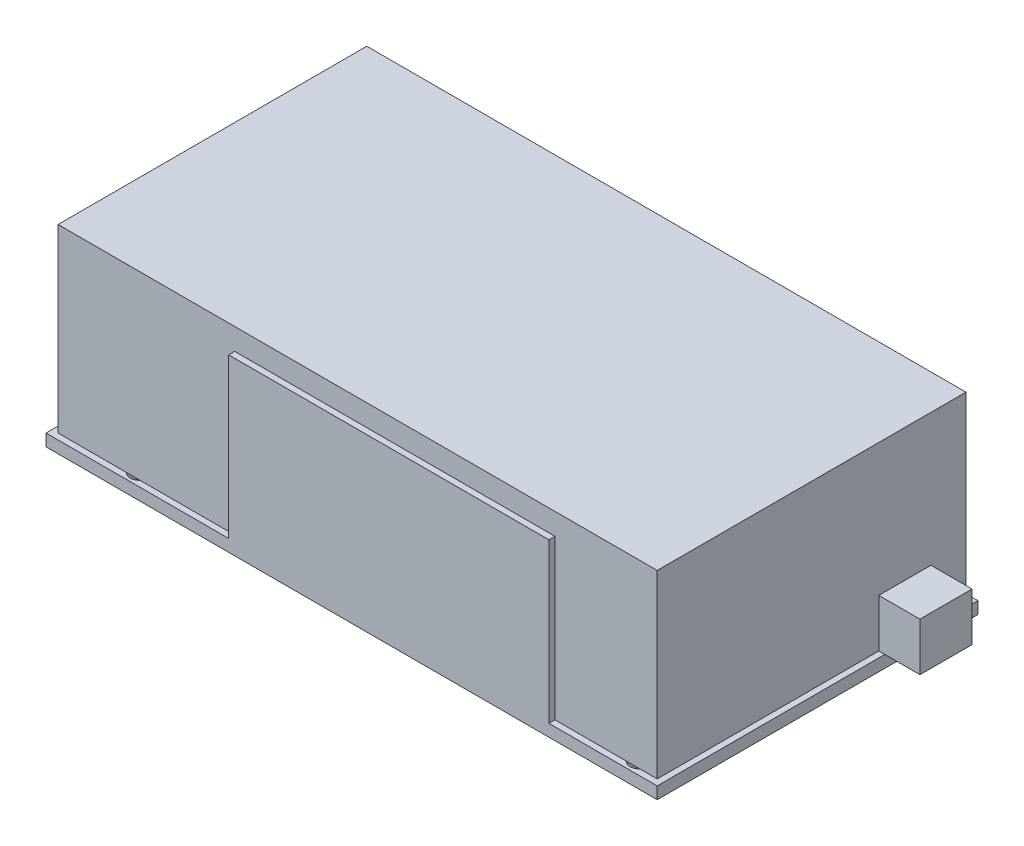
ISO-10303-21;
HEADER;
FILE_DESCRIPTION(('STEP AP214'),'2;1');
FILE_NAME('part.step','',(''),(''),'','','');
FILE_SCHEMA(('AUTOMOTIVE_DESIGN { 1 0 10303 214 1 1 1 1 }'));
ENDSEC;
DATA;
#1=APPLICATION_CONTEXT('core data for automotive mechanical design processes');
#2=APPLICATION_PROTOCOL_DEFINITION('international standard','automotive_design',2000,#1);
#3=PRODUCT_CONTEXT('',#1,'mechanical');
#4=PRODUCT('Part','Part','',(#3));
#5=PRODUCT_RELATED_PRODUCT_CATEGORY('part','',(#4));
#6=PRODUCT_DEFINITION_FORMATION('','',#4);
#7=PRODUCT_DEFINITION_CONTEXT('part definition',#1,'design');
#8=PRODUCT_DEFINITION('design','',#6,#7);
#9=PRODUCT_DEFINITION_SHAPE('','',#8);
#10=(LENGTH_UNIT() NAMED_UNIT(*) SI_UNIT(.MILLI.,.METRE.));
#11=(NAMED_UNIT(*) PLANE_ANGLE_UNIT() SI_UNIT($,.RADIAN.));
#12=(NAMED_UNIT(*) SI_UNIT($,.STERADIAN.) SOLID_ANGLE_UNIT());
#13=UNCERTAINTY_MEASURE_WITH_UNIT(LENGTH_MEASURE(1.E-05),#10,'distance_accuracy_value','');
#14=(GEOMETRIC_REPRESENTATION_CONTEXT(3) GLOBAL_UNCERTAINTY_ASSIGNED_CONTEXT((#13)) GLOBAL_UNIT_ASSIGNED_CONTEXT((#10,
#11,#12)) REPRESENTATION_CONTEXT('',''));
#15=CARTESIAN_POINT('',(0.,0.,0.));
#16=DIRECTION('',(0.,0.,1.));
#17=DIRECTION('',(1.,0.,0.));
#18=AXIS2_PLACEMENT_3D('',#15,#16,#17);
#19=CARTESIAN_POINT('',(0.,2.,0.));
#20=DIRECTION('',(0.,-1.,0.));
#21=DIRECTION('',(0.,0.,-1.));
#22=AXIS2_PLACEMENT_3D('',#19,#20,#21);
#23=PLANE('',#22);
#24=DIRECTION('',(1.,0.,0.));
#25=VECTOR('',#24,1.);
#26=CARTESIAN_POINT('',(39.6808869420511,2.,-11.1675009863461));
#27=LINE('',#26,#25);
#28=CARTESIAN_POINT('',(49.775,2.,-11.1675009863461));
#29=VERTEX_POINT('',#28);
#30=CARTESIAN_POINT('',(50.775,2.,-11.1675009863461));
#31=VERTEX_POINT('',#30);
#32=EDGE_CURVE('E231',#29,#31,#27,.T.);
#33=ORIENTED_EDGE('',*,*,#32,.F.);
#34=DIRECTION('',(0.,0.,-1.));
#35=VECTOR('',#34,1.);
#36=CARTESIAN_POINT('',(49.775,2.,-25.65));
#37=LINE('',#36,#35);
#38=CARTESIAN_POINT('',(49.775,2.,25.65));
#39=VERTEX_POINT('',#38);
#40=EDGE_CURVE('E258',#39,#29,#37,.T.);
#41=ORIENTED_EDGE('',*,*,#40,.F.);
#42=DIRECTION('',(1.,0.,0.));
#43=VECTOR('',#42,1.);
#44=CARTESIAN_POINT('',(-49.775,2.,25.65));
#45=LINE('',#44,#43);
#46=CARTESIAN_POINT('',(46.8930339887499,2.,25.65));
#47=VERTEX_POINT('',#46);
#48=EDGE_CURVE('E252',#47,#39,#45,.T.);
#49=ORIENTED_EDGE('',*,*,#48,.F.);
#50=CARTESIAN_POINT('',(45.775,2.,24.65));
#51=DIRECTION('',(0.,-1.,0.));
#52=DIRECTION('',(0.,0.,-1.));
#53=AXIS2_PLACEMENT_3D('',#50,#51,#52);
#54=CIRCLE('',#53,1.5);
#55=CARTESIAN_POINT('',(44.6569660112501,2.,25.65));
#56=VERTEX_POINT('',#55);
#57=EDGE_CURVE('E297',#56,#47,#54,.F.);
#58=ORIENTED_EDGE('',*,*,#57,.F.);
#59=CARTESIAN_POINT('',(32.775,2.,25.65));
#60=VERTEX_POINT('',#59);
#61=EDGE_CURVE('E383',#60,#56,#45,.T.);
#62=ORIENTED_EDGE('',*,*,#61,.F.);
#63=DIRECTION('',(0.,0.,-1.));
#64=VECTOR('',#63,1.);
#65=CARTESIAN_POINT('',(32.775,2.,-26.65));
#66=LINE('',#65,#64);
#67=CARTESIAN_POINT('',(32.775,2.,26.65));
#68=VERTEX_POINT('',#67);
#69=EDGE_CURVE('E477',#68,#60,#66,.T.);
#70=ORIENTED_EDGE('',*,*,#69,.F.);
#71=DIRECTION('',(1.,0.,0.));
#72=VECTOR('',#71,1.);
#73=CARTESIAN_POINT('',(-50.775,2.,26.65));
#74=LINE('',#73,#72);
#75=CARTESIAN_POINT('',(50.775,2.,26.65));
#76=VERTEX_POINT('',#75);
#77=EDGE_CURVE('E398',#68,#76,#74,.T.);
#78=ORIENTED_EDGE('',*,*,#77,.T.);
#79=DIRECTION('',(0.,0.,-1.));
#80=VECTOR('',#79,1.);
#81=CARTESIAN_POINT('',(50.775,2.,26.65));
#82=LINE('',#81,#80);
#83=EDGE_CURVE('E396',#76,#31,#82,.T.);
#84=ORIENTED_EDGE('',*,*,#83,.T.);
#85=EDGE_LOOP('',(#33,#41,#49,#58,#62,#70,#78,#84));
#86=FACE_BOUND('',#85,.T.);
#87=ADVANCED_FACE('F33',(#86),#23,.F.);
#88=DIRECTION('',(-1.,0.,0.));
#89=VECTOR('',#88,1.);
#90=CARTESIAN_POINT('',(39.6808869420511,2.,-19.8312775910949));
#91=LINE('',#90,#89);
#92=CARTESIAN_POINT('',(50.775,2.,-19.8312775910949));
#93=VERTEX_POINT('',#92);
#94=CARTESIAN_POINT('',(49.775,2.,-19.8312775910949));
#95=VERTEX_POINT('',#94);
#96=EDGE_CURVE('E48',#93,#95,#91,.T.);
#97=ORIENTED_EDGE('',*,*,#96,.F.);
#98=CARTESIAN_POINT('',(50.775,2.,-26.65));
#99=VERTEX_POINT('',#98);
#100=EDGE_CURVE('E402',#93,#99,#82,.T.);
#101=ORIENTED_EDGE('',*,*,#100,.T.);
#102=DIRECTION('',(-1.,0.,0.));
#103=VECTOR('',#102,1.);
#104=CARTESIAN_POINT('',(-50.775,2.,-26.65));
#105=LINE('',#104,#103);
#106=CARTESIAN_POINT('',(32.775,2.,-26.65));
#107=VERTEX_POINT('',#106);
#108=EDGE_CURVE('E530',#99,#107,#105,.T.);
#109=ORIENTED_EDGE('',*,*,#108,.T.);
#110=CARTESIAN_POINT('',(32.775,2.,-25.65));
#111=VERTEX_POINT('',#110);
#112=EDGE_CURVE('E332',#111,#107,#66,.T.);
#113=ORIENTED_EDGE('',*,*,#112,.F.);
#114=DIRECTION('',(-1.,0.,0.));
#115=VECTOR('',#114,1.);
#116=CARTESIAN_POINT('',(-49.775,2.,-25.65));
#117=LINE('',#116,#115);
#118=CARTESIAN_POINT('',(38.1569660112501,2.,-25.65));
#119=VERTEX_POINT('',#118);
#120=EDGE_CURVE('E354',#119,#111,#117,.T.);
#121=ORIENTED_EDGE('',*,*,#120,.F.);
#122=CARTESIAN_POINT('',(39.275,2.,-24.65));
#123=DIRECTION('',(0.,-1.,0.));
#124=DIRECTION('',(0.,0.,-1.));
#125=AXIS2_PLACEMENT_3D('',#122,#123,#124);
#126=CIRCLE('',#125,1.5);
#127=CARTESIAN_POINT('',(40.3930339887499,2.,-25.65));
#128=VERTEX_POINT('',#127);
#129=EDGE_CURVE('E288',#128,#119,#126,.F.);
#130=ORIENTED_EDGE('',*,*,#129,.F.);
#131=CARTESIAN_POINT('',(49.775,2.,-25.65));
#132=VERTEX_POINT('',#131);
#133=EDGE_CURVE('E243',#132,#128,#117,.T.);
#134=ORIENTED_EDGE('',*,*,#133,.F.);
#135=EDGE_CURVE('E256',#95,#132,#37,.T.);
#136=ORIENTED_EDGE('',*,*,#135,.F.);
#137=EDGE_LOOP('',(#97,#101,#109,#113,#121,#130,#134,#136));
#138=FACE_BOUND('',#137,.T.);
#139=ADVANCED_FACE('F342',(#138),#23,.F.);
#140=CARTESIAN_POINT('',(49.775,32.,-25.65));
#141=DIRECTION('',(-1.,0.,0.));
#142=DIRECTION('',(0.,0.,1.));
#143=AXIS2_PLACEMENT_3D('',#140,#141,#142);
#144=PLANE('',#143);
#145=DIRECTION('',(0.,-1.,0.));
#146=VECTOR('',#145,1.);
#147=CARTESIAN_POINT('',(49.775,32.,-11.1675009863461));
#148=LINE('',#147,#146);
#149=CARTESIAN_POINT('',(49.775,10.,-11.1675009863461));
#150=VERTEX_POINT('',#149);
#151=EDGE_CURVE('E11',#150,#29,#148,.T.);
#152=ORIENTED_EDGE('',*,*,#151,.F.);
#153=DIRECTION('',(0.,0.,1.));
#154=VECTOR('',#153,1.);
#155=CARTESIAN_POINT('',(49.775,10.,-25.65));
#156=LINE('',#155,#154);
#157=CARTESIAN_POINT('',(49.775,10.,-19.8312775910949));
#158=VERTEX_POINT('',#157);
#159=EDGE_CURVE('E209',#158,#150,#156,.T.);
#160=ORIENTED_EDGE('',*,*,#159,.F.);
#161=DIRECTION('',(0.,1.,0.));
#162=VECTOR('',#161,1.);
#163=CARTESIAN_POINT('',(49.775,32.,-19.8312775910949));
#164=LINE('',#163,#162);
#165=EDGE_CURVE('E41',#95,#158,#164,.T.);
#166=ORIENTED_EDGE('',*,*,#165,.F.);
#167=ORIENTED_EDGE('',*,*,#135,.T.);
#168=DIRECTION('',(0.,-1.,0.));
#169=VECTOR('',#168,1.);
#170=CARTESIAN_POINT('',(49.775,32.,-25.65));
#171=LINE('',#170,#169);
#172=CARTESIAN_POINT('',(49.775,32.,-25.65));
#173=VERTEX_POINT('',#172);
#174=EDGE_CURVE('E266',#173,#132,#171,.T.);
#175=ORIENTED_EDGE('',*,*,#174,.F.);
#176=DIRECTION('',(0.,0.,-1.));
#177=VECTOR('',#176,1.);
#178=CARTESIAN_POINT('',(49.775,32.,-25.65));
#179=LINE('',#178,#177);
#180=CARTESIAN_POINT('',(49.775,32.,25.65));
#181=VERTEX_POINT('',#180);
#182=EDGE_CURVE('E245',#181,#173,#179,.T.);
#183=ORIENTED_EDGE('',*,*,#182,.F.);
#184=DIRECTION('',(0.,-1.,0.));
#185=VECTOR('',#184,1.);
#186=CARTESIAN_POINT('',(49.775,32.,25.65));
#187=LINE('',#186,#185);
#188=EDGE_CURVE('E269',#181,#39,#187,.T.);
#189=ORIENTED_EDGE('',*,*,#188,.T.);
#190=ORIENTED_EDGE('',*,*,#40,.T.);
#191=EDGE_LOOP('',(#152,#160,#166,#167,#175,#183,#189,#190));
#192=FACE_BOUND('',#191,.T.);
#193=ADVANCED_FACE('F339',(#192),#144,.F.);
#194=CARTESIAN_POINT('',(-36.1569660112501,2.,25.65));
#195=VERTEX_POINT('',#194);
#196=CARTESIAN_POINT('',(-20.425,2.,25.65));
#197=VERTEX_POINT('',#196);
#198=EDGE_CURVE('E382',#195,#197,#45,.T.);
#199=ORIENTED_EDGE('',*,*,#198,.F.);
#200=CARTESIAN_POINT('',(-37.275,2.,24.65));
#201=DIRECTION('',(0.,-1.,0.));
#202=DIRECTION('',(0.,0.,-1.));
#203=AXIS2_PLACEMENT_3D('',#200,#201,#202);
#204=CIRCLE('',#203,1.5);
#205=CARTESIAN_POINT('',(-38.3930339887499,2.,25.65));
#206=VERTEX_POINT('',#205);
#207=EDGE_CURVE('E303',#206,#195,#204,.F.);
#208=ORIENTED_EDGE('',*,*,#207,.F.);
#209=CARTESIAN_POINT('',(-49.775,2.,25.65));
#210=VERTEX_POINT('',#209);
#211=EDGE_CURVE('E253',#210,#206,#45,.T.);
#212=ORIENTED_EDGE('',*,*,#211,.F.);
#213=DIRECTION('',(0.,0.,1.));
#214=VECTOR('',#213,1.);
#215=CARTESIAN_POINT('',(-49.775,2.,-25.65));
#216=LINE('',#215,#214);
#217=CARTESIAN_POINT('',(-49.775,2.,-25.65));
#218=VERTEX_POINT('',#217);
#219=EDGE_CURVE('E238',#218,#210,#216,.T.);
#220=ORIENTED_EDGE('',*,*,#219,.F.);
#221=CARTESIAN_POINT('',(-37.3930339887499,2.,-25.65));
#222=VERTEX_POINT('',#221);
#223=EDGE_CURVE('E261',#222,#218,#117,.T.);
#224=ORIENTED_EDGE('',*,*,#223,.F.);
#225=CARTESIAN_POINT('',(-36.275,2.,-24.65));
#226=DIRECTION('',(0.,-1.,0.));
#227=DIRECTION('',(0.,0.,-1.));
#228=AXIS2_PLACEMENT_3D('',#225,#226,#227);
#229=CIRCLE('',#228,1.5);
#230=CARTESIAN_POINT('',(-35.1569660112501,2.,-25.65));
#231=VERTEX_POINT('',#230);
#232=EDGE_CURVE('E292',#231,#222,#229,.F.);
#233=ORIENTED_EDGE('',*,*,#232,.F.);
#234=CARTESIAN_POINT('',(-20.425,2.,-25.65));
#235=VERTEX_POINT('',#234);
#236=EDGE_CURVE('E355',#235,#231,#117,.T.);
#237=ORIENTED_EDGE('',*,*,#236,.F.);
#238=DIRECTION('',(0.,0.,1.));
#239=VECTOR('',#238,1.);
#240=CARTESIAN_POINT('',(-20.425,2.,26.65));
#241=LINE('',#240,#239);
#242=CARTESIAN_POINT('',(-20.425,2.,-26.65));
#243=VERTEX_POINT('',#242);
#244=EDGE_CURVE('E326',#243,#235,#241,.T.);
#245=ORIENTED_EDGE('',*,*,#244,.F.);
#246=CARTESIAN_POINT('',(-50.775,2.,-26.65));
#247=VERTEX_POINT('',#246);
#248=EDGE_CURVE('E401',#243,#247,#105,.T.);
#249=ORIENTED_EDGE('',*,*,#248,.T.);
#250=DIRECTION('',(0.,0.,1.));
#251=VECTOR('',#250,1.);
#252=CARTESIAN_POINT('',(-50.775,2.,26.65));
#253=LINE('',#252,#251);
#254=CARTESIAN_POINT('',(-50.775,2.,26.65));
#255=VERTEX_POINT('',#254);
#256=EDGE_CURVE('E503',#247,#255,#253,.T.);
#257=ORIENTED_EDGE('',*,*,#256,.T.);
#258=CARTESIAN_POINT('',(-20.425,2.,26.65));
#259=VERTEX_POINT('',#258);
#260=EDGE_CURVE('E502',#255,#259,#74,.T.);
#261=ORIENTED_EDGE('',*,*,#260,.T.);
#262=EDGE_CURVE('E306',#197,#259,#241,.T.);
#263=ORIENTED_EDGE('',*,*,#262,.F.);
#264=EDGE_LOOP('',(#199,#208,#212,#220,#224,#233,#237,#245,#249,#257,#261,#263));
#265=FACE_BOUND('',#264,.T.);
#266=ADVANCED_FACE('F373',(#265),#23,.F.);
#267=CARTESIAN_POINT('',(-20.425,28.4166876881282,26.65));
#268=DIRECTION('',(1.,0.,0.));
#269=DIRECTION('',(0.,0.,-1.));
#270=AXIS2_PLACEMENT_3D('',#267,#268,#269);
#271=PLANE('',#270);
#272=DIRECTION('',(0.,1.,0.));
#273=VECTOR('',#272,1.);
#274=CARTESIAN_POINT('',(-20.425,28.4166876881282,25.65));
#275=LINE('',#274,#273);
#276=CARTESIAN_POINT('',(-20.425,28.4166876881282,25.65));
#277=VERTEX_POINT('',#276);
#278=EDGE_CURVE('E286',#197,#277,#275,.T.);
#279=ORIENTED_EDGE('',*,*,#278,.F.);
#280=ORIENTED_EDGE('',*,*,#262,.T.);
#281=DIRECTION('',(0.,-1.,0.));
#282=VECTOR('',#281,1.);
#283=CARTESIAN_POINT('',(-20.425,28.4166876881282,26.65));
#284=LINE('',#283,#282);
#285=CARTESIAN_POINT('',(-20.425,28.4166876881282,26.65));
#286=VERTEX_POINT('',#285);
#287=EDGE_CURVE('E486',#286,#259,#284,.T.);
#288=ORIENTED_EDGE('',*,*,#287,.F.);
#289=DIRECTION('',(0.,0.,1.));
#290=VECTOR('',#289,1.);
#291=CARTESIAN_POINT('',(-20.425,28.4166876881282,26.65));
#292=LINE('',#291,#290);
#293=EDGE_CURVE('E311',#277,#286,#292,.T.);
#294=ORIENTED_EDGE('',*,*,#293,.F.);
#295=EDGE_LOOP('',(#279,#280,#288,#294));
#296=FACE_BOUND('',#295,.T.);
#297=ADVANCED_FACE('F423',(#296),#271,.F.);
#298=DIRECTION('',(0.,-1.,0.));
#299=VECTOR('',#298,1.);
#300=CARTESIAN_POINT('',(-20.425,28.4166876881282,-25.65));
#301=LINE('',#300,#299);
#302=CARTESIAN_POINT('',(-20.425,28.4166876881282,-25.65));
#303=VERTEX_POINT('',#302);
#304=EDGE_CURVE('E282',#303,#235,#301,.T.);
#305=ORIENTED_EDGE('',*,*,#304,.F.);
#306=CARTESIAN_POINT('',(-20.425,28.4166876881282,-26.65));
#307=VERTEX_POINT('',#306);
#308=EDGE_CURVE('E307',#307,#303,#292,.T.);
#309=ORIENTED_EDGE('',*,*,#308,.F.);
#310=DIRECTION('',(0.,-1.,0.));
#311=VECTOR('',#310,1.);
#312=CARTESIAN_POINT('',(-20.425,28.4166876881282,-26.65));
#313=LINE('',#312,#311);
#314=EDGE_CURVE('E319',#307,#243,#313,.T.);
#315=ORIENTED_EDGE('',*,*,#314,.T.);
#316=ORIENTED_EDGE('',*,*,#244,.T.);
#317=EDGE_LOOP('',(#305,#309,#315,#316));
#318=FACE_BOUND('',#317,.T.);
#319=ADVANCED_FACE('F428',(#318),#271,.F.);
#320=CARTESIAN_POINT('',(32.775,28.4166876881282,-26.65));
#321=DIRECTION('',(-1.,0.,0.));
#322=DIRECTION('',(0.,0.,1.));
#323=AXIS2_PLACEMENT_3D('',#320,#321,#322);
#324=PLANE('',#323);
#325=DIRECTION('',(0.,-1.,0.));
#326=VECTOR('',#325,1.);
#327=CARTESIAN_POINT('',(32.775,28.4166876881282,25.65));
#328=LINE('',#327,#326);
#329=CARTESIAN_POINT('',(32.775,28.4166876881282,25.65));
#330=VERTEX_POINT('',#329);
#331=EDGE_CURVE('E284',#330,#60,#328,.T.);
#332=ORIENTED_EDGE('',*,*,#331,.F.);
#333=DIRECTION('',(0.,0.,-1.));
#334=VECTOR('',#333,1.);
#335=CARTESIAN_POINT('',(32.775,28.4166876881282,-26.65));
#336=LINE('',#335,#334);
#337=CARTESIAN_POINT('',(32.775,28.4166876881282,26.65));
#338=VERTEX_POINT('',#337);
#339=EDGE_CURVE('E314',#338,#330,#336,.T.);
#340=ORIENTED_EDGE('',*,*,#339,.F.);
#341=DIRECTION('',(0.,-1.,0.));
#342=VECTOR('',#341,1.);
#343=CARTESIAN_POINT('',(32.775,28.4166876881282,26.65));
#344=LINE('',#343,#342);
#345=EDGE_CURVE('E485',#338,#68,#344,.T.);
#346=ORIENTED_EDGE('',*,*,#345,.T.);
#347=ORIENTED_EDGE('',*,*,#69,.T.);
#348=EDGE_LOOP('',(#332,#340,#346,#347));
#349=FACE_BOUND('',#348,.T.);
#350=ADVANCED_FACE('F464',(#349),#324,.F.);
#351=DIRECTION('',(0.,1.,0.));
#352=VECTOR('',#351,1.);
#353=CARTESIAN_POINT('',(32.775,28.4166876881282,-25.65));
#354=LINE('',#353,#352);
#355=CARTESIAN_POINT('',(32.775,28.4166876881282,-25.65));
#356=VERTEX_POINT('',#355);
#357=EDGE_CURVE('E280',#111,#356,#354,.T.);
#358=ORIENTED_EDGE('',*,*,#357,.F.);
#359=ORIENTED_EDGE('',*,*,#112,.T.);
#360=DIRECTION('',(0.,-1.,0.));
#361=VECTOR('',#360,1.);
#362=CARTESIAN_POINT('',(32.775,28.4166876881282,-26.65));
#363=LINE('',#362,#361);
#364=CARTESIAN_POINT('',(32.775,28.4166876881282,-26.65));
#365=VERTEX_POINT('',#364);
#366=EDGE_CURVE('E487',#365,#107,#363,.T.);
#367=ORIENTED_EDGE('',*,*,#366,.F.);
#368=EDGE_CURVE('E313',#356,#365,#336,.T.);
#369=ORIENTED_EDGE('',*,*,#368,.F.);
#370=EDGE_LOOP('',(#358,#359,#367,#369));
#371=FACE_BOUND('',#370,.T.);
#372=ADVANCED_FACE('F462',(#371),#324,.F.);
#373=CARTESIAN_POINT('',(0.,28.4166876881282,0.));
#374=DIRECTION('',(0.,-1.,0.));
#375=DIRECTION('',(0.,0.,-1.));
#376=AXIS2_PLACEMENT_3D('',#373,#374,#375);
#377=PLANE('',#376);
#378=DIRECTION('',(1.,0.,0.));
#379=VECTOR('',#378,1.);
#380=CARTESIAN_POINT('',(0.,28.4166876881282,25.65));
#381=LINE('',#380,#379);
#382=EDGE_CURVE('E334',#277,#330,#381,.T.);
#383=ORIENTED_EDGE('',*,*,#382,.F.);
#384=ORIENTED_EDGE('',*,*,#293,.T.);
#385=DIRECTION('',(1.,0.,0.));
#386=VECTOR('',#385,1.);
#387=CARTESIAN_POINT('',(32.775,28.4166876881282,26.65));
#388=LINE('',#387,#386);
#389=EDGE_CURVE('E310',#286,#338,#388,.T.);
#390=ORIENTED_EDGE('',*,*,#389,.T.);
#391=ORIENTED_EDGE('',*,*,#339,.T.);
#392=EDGE_LOOP('',(#383,#384,#390,#391));
#393=FACE_BOUND('',#392,.T.);
#394=ADVANCED_FACE('F458',(#393),#377,.F.);
#395=DIRECTION('',(-1.,0.,0.));
#396=VECTOR('',#395,1.);
#397=CARTESIAN_POINT('',(0.,28.4166876881282,-25.65));
#398=LINE('',#397,#396);
#399=EDGE_CURVE('E529',#356,#303,#398,.T.);
#400=ORIENTED_EDGE('',*,*,#399,.F.);
#401=ORIENTED_EDGE('',*,*,#368,.T.);
#402=DIRECTION('',(-1.,0.,0.));
#403=VECTOR('',#402,1.);
#404=CARTESIAN_POINT('',(-20.425,28.4166876881282,-26.65));
#405=LINE('',#404,#403);
#406=EDGE_CURVE('E317',#365,#307,#405,.T.);
#407=ORIENTED_EDGE('',*,*,#406,.T.);
#408=ORIENTED_EDGE('',*,*,#308,.T.);
#409=EDGE_LOOP('',(#400,#401,#407,#408));
#410=FACE_BOUND('',#409,.T.);
#411=ADVANCED_FACE('F461',(#410),#377,.F.);
#412=CARTESIAN_POINT('',(0.,0.,0.));
#413=DIRECTION('',(0.,-1.,0.));
#414=DIRECTION('',(0.,0.,-1.));
#415=AXIS2_PLACEMENT_3D('',#412,#413,#414);
#416=PLANE('',#415);
#417=CARTESIAN_POINT('',(-36.275,0.,-24.65));
#418=DIRECTION('',(0.,-1.,0.));
#419=DIRECTION('',(0.,0.,-1.));
#420=AXIS2_PLACEMENT_3D('',#417,#418,#419);
#421=CIRCLE('',#420,1.5);
#422=CARTESIAN_POINT('',(-36.275,0.,-26.15));
#423=VERTEX_POINT('',#422);
#424=EDGE_CURVE('E294',#423,#423,#421,.F.);
#425=ORIENTED_EDGE('',*,*,#424,.T.);
#426=EDGE_LOOP('',(#425));
#427=FACE_BOUND('',#426,.T.);
#428=CARTESIAN_POINT('',(-37.275,0.,24.65));
#429=DIRECTION('',(0.,-1.,0.));
#430=DIRECTION('',(0.,0.,-1.));
#431=AXIS2_PLACEMENT_3D('',#428,#429,#430);
#432=CIRCLE('',#431,1.5);
#433=CARTESIAN_POINT('',(-37.275,0.,23.15));
#434=VERTEX_POINT('',#433);
#435=EDGE_CURVE('E302',#434,#434,#432,.F.);
#436=ORIENTED_EDGE('',*,*,#435,.T.);
#437=EDGE_LOOP('',(#436));
#438=FACE_BOUND('',#437,.T.);
#439=DIRECTION('',(0.,0.,-1.));
#440=VECTOR('',#439,1.);
#441=CARTESIAN_POINT('',(50.775,0.,26.65));
#442=LINE('',#441,#440);
#443=CARTESIAN_POINT('',(50.775,0.,26.65));
#444=VERTEX_POINT('',#443);
#445=CARTESIAN_POINT('',(50.775,0.,-26.65));
#446=VERTEX_POINT('',#445);
#447=EDGE_CURVE('E489',#444,#446,#442,.T.);
#448=ORIENTED_EDGE('',*,*,#447,.F.);
#449=DIRECTION('',(1.,0.,0.));
#450=VECTOR('',#449,1.);
#451=CARTESIAN_POINT('',(-50.775,0.,26.65));
#452=LINE('',#451,#450);
#453=CARTESIAN_POINT('',(-50.775,0.,26.65));
#454=VERTEX_POINT('',#453);
#455=EDGE_CURVE('E516',#454,#444,#452,.T.);
#456=ORIENTED_EDGE('',*,*,#455,.F.);
#457=DIRECTION('',(0.,0.,1.));
#458=VECTOR('',#457,1.);
#459=CARTESIAN_POINT('',(-50.775,0.,26.65));
#460=LINE('',#459,#458);
#461=CARTESIAN_POINT('',(-50.775,0.,-26.65));
#462=VERTEX_POINT('',#461);
#463=EDGE_CURVE('E514',#462,#454,#460,.T.);
#464=ORIENTED_EDGE('',*,*,#463,.F.);
#465=DIRECTION('',(-1.,0.,0.));
#466=VECTOR('',#465,1.);
#467=CARTESIAN_POINT('',(-50.775,0.,-26.65));
#468=LINE('',#467,#466);
#469=EDGE_CURVE('E512',#446,#462,#468,.T.);
#470=ORIENTED_EDGE('',*,*,#469,.F.);
#471=EDGE_LOOP('',(#448,#456,#464,#470));
#472=FACE_BOUND('',#471,.T.);
#473=CARTESIAN_POINT('',(45.775,0.,24.65));
#474=DIRECTION('',(0.,-1.,0.));
#475=DIRECTION('',(0.,0.,-1.));
#476=AXIS2_PLACEMENT_3D('',#473,#474,#475);
#477=CIRCLE('',#476,1.5);
#478=CARTESIAN_POINT('',(45.775,0.,23.15));
#479=VERTEX_POINT('',#478);
#480=EDGE_CURVE('E299',#479,#479,#477,.F.);
#481=ORIENTED_EDGE('',*,*,#480,.T.);
#482=EDGE_LOOP('',(#481));
#483=FACE_BOUND('',#482,.T.);
#484=CARTESIAN_POINT('',(39.275,0.,-24.65));
#485=DIRECTION('',(0.,-1.,0.));
#486=DIRECTION('',(0.,0.,-1.));
#487=AXIS2_PLACEMENT_3D('',#484,#485,#486);
#488=CIRCLE('',#487,1.5);
#489=CARTESIAN_POINT('',(39.275,0.,-26.15));
#490=VERTEX_POINT('',#489);
#491=EDGE_CURVE('E289',#490,#490,#488,.F.);
#492=ORIENTED_EDGE('',*,*,#491,.T.);
#493=EDGE_LOOP('',(#492));
#494=FACE_BOUND('',#493,.T.);
#495=ADVANCED_FACE('F571',(#427,#438,#472,#483,#494),#416,.T.);
#496=CARTESIAN_POINT('',(50.775,2.,26.65));
#497=DIRECTION('',(-1.,0.,0.));
#498=DIRECTION('',(0.,0.,1.));
#499=AXIS2_PLACEMENT_3D('',#496,#497,#498);
#500=PLANE('',#499);
#501=ORIENTED_EDGE('',*,*,#447,.T.);
#502=DIRECTION('',(0.,-1.,0.));
#503=VECTOR('',#502,1.);
#504=CARTESIAN_POINT('',(50.775,2.,-26.65));
#505=LINE('',#504,#503);
#506=EDGE_CURVE('E526',#99,#446,#505,.T.);
#507=ORIENTED_EDGE('',*,*,#506,.F.);
#508=ORIENTED_EDGE('',*,*,#100,.F.);
#509=DIRECTION('',(0.,0.,1.));
#510=VECTOR('',#509,1.);
#511=CARTESIAN_POINT('',(50.775,2.,26.65));
#512=LINE('',#511,#510);
#513=EDGE_CURVE('E55',#93,#31,#512,.T.);
#514=ORIENTED_EDGE('',*,*,#513,.T.);
#515=ORIENTED_EDGE('',*,*,#83,.F.);
#516=DIRECTION('',(0.,-1.,0.));
#517=VECTOR('',#516,1.);
#518=CARTESIAN_POINT('',(50.775,2.,26.65));
#519=LINE('',#518,#517);
#520=EDGE_CURVE('E518',#76,#444,#519,.T.);
#521=ORIENTED_EDGE('',*,*,#520,.T.);
#522=EDGE_LOOP('',(#501,#507,#508,#514,#515,#521));
#523=FACE_BOUND('',#522,.T.);
#524=ADVANCED_FACE('F35',(#523),#500,.F.);
#525=CARTESIAN_POINT('',(-50.775,2.,-26.65));
#526=DIRECTION('',(0.,0.,1.));
#527=DIRECTION('',(1.,0.,0.));
#528=AXIS2_PLACEMENT_3D('',#525,#526,#527);
#529=PLANE('',#528);
#530=ORIENTED_EDGE('',*,*,#469,.T.);
#531=DIRECTION('',(0.,-1.,0.));
#532=VECTOR('',#531,1.);
#533=CARTESIAN_POINT('',(-50.775,2.,-26.65));
#534=LINE('',#533,#532);
#535=EDGE_CURVE('E523',#247,#462,#534,.T.);
#536=ORIENTED_EDGE('',*,*,#535,.F.);
#537=ORIENTED_EDGE('',*,*,#248,.F.);
#538=ORIENTED_EDGE('',*,*,#314,.F.);
#539=ORIENTED_EDGE('',*,*,#406,.F.);
#540=ORIENTED_EDGE('',*,*,#366,.T.);
#541=ORIENTED_EDGE('',*,*,#108,.F.);
#542=ORIENTED_EDGE('',*,*,#506,.T.);
#543=EDGE_LOOP('',(#530,#536,#537,#538,#539,#540,#541,#542));
#544=FACE_BOUND('',#543,.T.);
#545=ADVANCED_FACE('F543',(#544),#529,.F.);
#546=CARTESIAN_POINT('',(-50.775,2.,26.65));
#547=DIRECTION('',(1.,0.,0.));
#548=DIRECTION('',(0.,0.,-1.));
#549=AXIS2_PLACEMENT_3D('',#546,#547,#548);
#550=PLANE('',#549);
#551=ORIENTED_EDGE('',*,*,#463,.T.);
#552=DIRECTION('',(0.,-1.,0.));
#553=VECTOR('',#552,1.);
#554=CARTESIAN_POINT('',(-50.775,2.,26.65));
#555=LINE('',#554,#553);
#556=EDGE_CURVE('E520',#255,#454,#555,.T.);
#557=ORIENTED_EDGE('',*,*,#556,.F.);
#558=ORIENTED_EDGE('',*,*,#256,.F.);
#559=ORIENTED_EDGE('',*,*,#535,.T.);
#560=EDGE_LOOP('',(#551,#557,#558,#559));
#561=FACE_BOUND('',#560,.T.);
#562=ADVANCED_FACE('F546',(#561),#550,.F.);
#563=CARTESIAN_POINT('',(-50.775,2.,26.65));
#564=DIRECTION('',(0.,0.,-1.));
#565=DIRECTION('',(-1.,0.,0.));
#566=AXIS2_PLACEMENT_3D('',#563,#564,#565);
#567=PLANE('',#566);
#568=ORIENTED_EDGE('',*,*,#455,.T.);
#569=ORIENTED_EDGE('',*,*,#520,.F.);
#570=ORIENTED_EDGE('',*,*,#77,.F.);
#571=ORIENTED_EDGE('',*,*,#345,.F.);
#572=ORIENTED_EDGE('',*,*,#389,.F.);
#573=ORIENTED_EDGE('',*,*,#287,.T.);
#574=ORIENTED_EDGE('',*,*,#260,.F.);
#575=ORIENTED_EDGE('',*,*,#556,.T.);
#576=EDGE_LOOP('',(#568,#569,#570,#571,#572,#573,#574,#575));
#577=FACE_BOUND('',#576,.T.);
#578=ADVANCED_FACE('F456',(#577),#567,.F.);
#579=CARTESIAN_POINT('',(-37.275,28.4167126881282,24.65));
#580=DIRECTION('',(0.,-1.,0.));
#581=DIRECTION('',(0.,0.,-1.));
#582=AXIS2_PLACEMENT_3D('',#579,#580,#581);
#583=CYLINDRICAL_SURFACE('',#582,1.5);
#584=ORIENTED_EDGE('',*,*,#435,.F.);
#585=EDGE_LOOP('',(#584));
#586=FACE_BOUND('',#585,.T.);
#587=ORIENTED_EDGE('',*,*,#207,.T.);
#588=CARTESIAN_POINT('',(-37.275,2.,24.65));
#589=DIRECTION('',(0.,1.,0.));
#590=DIRECTION('',(0.,0.,1.));
#591=AXIS2_PLACEMENT_3D('',#588,#589,#590);
#592=CIRCLE('',#591,1.5);
#593=EDGE_CURVE('E277',#195,#206,#592,.T.);
#594=ORIENTED_EDGE('',*,*,#593,.T.);
#595=EDGE_LOOP('',(#587,#594));
#596=FACE_BOUND('',#595,.T.);
#597=ADVANCED_FACE('F379',(#586,#596),#583,.F.);
#598=CARTESIAN_POINT('',(45.775,28.4167126881282,24.65));
#599=DIRECTION('',(0.,-1.,0.));
#600=DIRECTION('',(0.,0.,-1.));
#601=AXIS2_PLACEMENT_3D('',#598,#599,#600);
#602=CYLINDRICAL_SURFACE('',#601,1.5);
#603=ORIENTED_EDGE('',*,*,#480,.F.);
#604=EDGE_LOOP('',(#603));
#605=FACE_BOUND('',#604,.T.);
#606=ORIENTED_EDGE('',*,*,#57,.T.);
#607=CARTESIAN_POINT('',(45.775,2.,24.65));
#608=DIRECTION('',(0.,1.,0.));
#609=DIRECTION('',(0.,0.,1.));
#610=AXIS2_PLACEMENT_3D('',#607,#608,#609);
#611=CIRCLE('',#610,1.5);
#612=EDGE_CURVE('E274',#47,#56,#611,.T.);
#613=ORIENTED_EDGE('',*,*,#612,.T.);
#614=EDGE_LOOP('',(#606,#613));
#615=FACE_BOUND('',#614,.T.);
#616=ADVANCED_FACE('F449',(#605,#615),#602,.F.);
#617=CARTESIAN_POINT('',(-36.275,28.4167126881282,-24.65));
#618=DIRECTION('',(0.,-1.,0.));
#619=DIRECTION('',(0.,0.,-1.));
#620=AXIS2_PLACEMENT_3D('',#617,#618,#619);
#621=CYLINDRICAL_SURFACE('',#620,1.5);
#622=ORIENTED_EDGE('',*,*,#424,.F.);
#623=EDGE_LOOP('',(#622));
#624=FACE_BOUND('',#623,.T.);
#625=EDGE_CURVE('E298',#222,#231,#229,.F.);
#626=ORIENTED_EDGE('',*,*,#625,.T.);
#627=ORIENTED_EDGE('',*,*,#232,.T.);
#628=EDGE_LOOP('',(#626,#627));
#629=FACE_BOUND('',#628,.T.);
#630=ADVANCED_FACE('F445',(#624,#629),#621,.F.);
#631=CARTESIAN_POINT('',(39.275,28.4167126881282,-24.65));
#632=DIRECTION('',(0.,-1.,0.));
#633=DIRECTION('',(0.,0.,-1.));
#634=AXIS2_PLACEMENT_3D('',#631,#632,#633);
#635=CYLINDRICAL_SURFACE('',#634,1.5);
#636=ORIENTED_EDGE('',*,*,#491,.F.);
#637=EDGE_LOOP('',(#636));
#638=FACE_BOUND('',#637,.T.);
#639=EDGE_CURVE('E293',#119,#128,#126,.F.);
#640=ORIENTED_EDGE('',*,*,#639,.T.);
#641=ORIENTED_EDGE('',*,*,#129,.T.);
#642=EDGE_LOOP('',(#640,#641));
#643=FACE_BOUND('',#642,.T.);
#644=ADVANCED_FACE('F438',(#638,#643),#635,.F.);
#645=CARTESIAN_POINT('',(-49.775,32.,25.65));
#646=DIRECTION('',(0.,0.,-1.));
#647=DIRECTION('',(-1.,0.,0.));
#648=AXIS2_PLACEMENT_3D('',#645,#646,#647);
#649=PLANE('',#648);
#650=ORIENTED_EDGE('',*,*,#198,.T.);
#651=ORIENTED_EDGE('',*,*,#278,.T.);
#652=ORIENTED_EDGE('',*,*,#382,.T.);
#653=ORIENTED_EDGE('',*,*,#331,.T.);
#654=ORIENTED_EDGE('',*,*,#61,.T.);
#655=EDGE_CURVE('E386',#56,#47,#45,.T.);
#656=ORIENTED_EDGE('',*,*,#655,.T.);
#657=ORIENTED_EDGE('',*,*,#48,.T.);
#658=ORIENTED_EDGE('',*,*,#188,.F.);
#659=DIRECTION('',(1.,0.,0.));
#660=VECTOR('',#659,1.);
#661=CARTESIAN_POINT('',(-49.775,32.,25.65));
#662=LINE('',#661,#660);
#663=CARTESIAN_POINT('',(-49.775,32.,25.65));
#664=VERTEX_POINT('',#663);
#665=EDGE_CURVE('E242',#664,#181,#662,.T.);
#666=ORIENTED_EDGE('',*,*,#665,.F.);
#667=DIRECTION('',(0.,-1.,0.));
#668=VECTOR('',#667,1.);
#669=CARTESIAN_POINT('',(-49.775,32.,25.65));
#670=LINE('',#669,#668);
#671=EDGE_CURVE('E272',#664,#210,#670,.T.);
#672=ORIENTED_EDGE('',*,*,#671,.T.);
#673=ORIENTED_EDGE('',*,*,#211,.T.);
#674=EDGE_CURVE('E257',#206,#195,#45,.T.);
#675=ORIENTED_EDGE('',*,*,#674,.T.);
#676=EDGE_LOOP('',(#650,#651,#652,#653,#654,#656,#657,#658,#666,#672,#673,#675));
#677=FACE_BOUND('',#676,.T.);
#678=ADVANCED_FACE('F377',(#677),#649,.F.);
#679=CARTESIAN_POINT('',(-49.775,32.,-25.65));
#680=DIRECTION('',(0.,0.,1.));
#681=DIRECTION('',(1.,0.,0.));
#682=AXIS2_PLACEMENT_3D('',#679,#680,#681);
#683=PLANE('',#682);
#684=ORIENTED_EDGE('',*,*,#399,.T.);
#685=ORIENTED_EDGE('',*,*,#304,.T.);
#686=ORIENTED_EDGE('',*,*,#236,.T.);
#687=EDGE_CURVE('E358',#231,#222,#117,.T.);
#688=ORIENTED_EDGE('',*,*,#687,.T.);
#689=ORIENTED_EDGE('',*,*,#223,.T.);
#690=DIRECTION('',(0.,-1.,0.));
#691=VECTOR('',#690,1.);
#692=CARTESIAN_POINT('',(-49.775,32.,-25.65));
#693=LINE('',#692,#691);
#694=CARTESIAN_POINT('',(-49.775,32.,-25.65));
#695=VERTEX_POINT('',#694);
#696=EDGE_CURVE('E249',#695,#218,#693,.T.);
#697=ORIENTED_EDGE('',*,*,#696,.F.);
#698=DIRECTION('',(-1.,0.,0.));
#699=VECTOR('',#698,1.);
#700=CARTESIAN_POINT('',(-49.775,32.,-25.65));
#701=LINE('',#700,#699);
#702=EDGE_CURVE('E247',#173,#695,#701,.T.);
#703=ORIENTED_EDGE('',*,*,#702,.F.);
#704=ORIENTED_EDGE('',*,*,#174,.T.);
#705=ORIENTED_EDGE('',*,*,#133,.T.);
#706=EDGE_CURVE('E263',#128,#119,#117,.T.);
#707=ORIENTED_EDGE('',*,*,#706,.T.);
#708=ORIENTED_EDGE('',*,*,#120,.T.);
#709=ORIENTED_EDGE('',*,*,#357,.T.);
#710=EDGE_LOOP('',(#684,#685,#686,#688,#689,#697,#703,#704,#705,#707,#708,#709));
#711=FACE_BOUND('',#710,.T.);
#712=ADVANCED_FACE('F350',(#711),#683,.F.);
#713=CARTESIAN_POINT('',(0.,2.,0.));
#714=DIRECTION('',(0.,1.,0.));
#715=DIRECTION('',(0.,0.,1.));
#716=AXIS2_PLACEMENT_3D('',#713,#714,#715);
#717=PLANE('',#716);
#718=ORIENTED_EDGE('',*,*,#593,.F.);
#719=ORIENTED_EDGE('',*,*,#674,.F.);
#720=EDGE_LOOP('',(#718,#719));
#721=FACE_BOUND('',#720,.T.);
#722=ADVANCED_FACE('F381',(#721),#717,.F.);
#723=ORIENTED_EDGE('',*,*,#612,.F.);
#724=ORIENTED_EDGE('',*,*,#655,.F.);
#725=EDGE_LOOP('',(#723,#724));
#726=FACE_BOUND('',#725,.T.);
#727=ADVANCED_FACE('F581',(#726),#717,.F.);
#728=ORIENTED_EDGE('',*,*,#625,.F.);
#729=ORIENTED_EDGE('',*,*,#687,.F.);
#730=EDGE_LOOP('',(#728,#729));
#731=FACE_BOUND('',#730,.T.);
#732=ADVANCED_FACE('F442',(#731),#717,.F.);
#733=CARTESIAN_POINT('',(-49.775,32.,-25.65));
#734=DIRECTION('',(1.,0.,0.));
#735=DIRECTION('',(0.,0.,-1.));
#736=AXIS2_PLACEMENT_3D('',#733,#734,#735);
#737=PLANE('',#736);
#738=ORIENTED_EDGE('',*,*,#219,.T.);
#739=ORIENTED_EDGE('',*,*,#671,.F.);
#740=DIRECTION('',(0.,0.,1.));
#741=VECTOR('',#740,1.);
#742=CARTESIAN_POINT('',(-49.775,32.,-25.65));
#743=LINE('',#742,#741);
#744=EDGE_CURVE('E239',#695,#664,#743,.T.);
#745=ORIENTED_EDGE('',*,*,#744,.F.);
#746=ORIENTED_EDGE('',*,*,#696,.T.);
#747=EDGE_LOOP('',(#738,#739,#745,#746));
#748=FACE_BOUND('',#747,.T.);
#749=ADVANCED_FACE('F369',(#748),#737,.F.);
#750=CARTESIAN_POINT('',(0.,32.,0.));
#751=DIRECTION('',(0.,1.,0.));
#752=DIRECTION('',(0.,0.,1.));
#753=AXIS2_PLACEMENT_3D('',#750,#751,#752);
#754=PLANE('',#753);
#755=ORIENTED_EDGE('',*,*,#744,.T.);
#756=ORIENTED_EDGE('',*,*,#665,.T.);
#757=ORIENTED_EDGE('',*,*,#182,.T.);
#758=ORIENTED_EDGE('',*,*,#702,.T.);
#759=EDGE_LOOP('',(#755,#756,#757,#758));
#760=FACE_BOUND('',#759,.T.);
#761=ADVANCED_FACE('F441',(#760),#754,.T.);
#762=ORIENTED_EDGE('',*,*,#639,.F.);
#763=ORIENTED_EDGE('',*,*,#706,.F.);
#764=EDGE_LOOP('',(#762,#763));
#765=FACE_BOUND('',#764,.T.);
#766=ADVANCED_FACE('F353',(#765),#717,.F.);
#767=CARTESIAN_POINT('',(39.6808869420511,10.,-11.1675009863461));
#768=DIRECTION('',(0.,0.,-1.));
#769=DIRECTION('',(-1.,0.,0.));
#770=AXIS2_PLACEMENT_3D('',#767,#768,#769);
#771=PLANE('',#770);
#772=DIRECTION('',(1.,0.,0.));
#773=VECTOR('',#772,1.);
#774=CARTESIAN_POINT('',(39.6808869420511,10.,-11.1675009863461));
#775=LINE('',#774,#773);
#776=CARTESIAN_POINT('',(56.6065440175976,10.,-11.1675009863461));
#777=VERTEX_POINT('',#776);
#778=EDGE_CURVE('E202',#150,#777,#775,.T.);
#779=ORIENTED_EDGE('',*,*,#778,.F.);
#780=ORIENTED_EDGE('',*,*,#151,.T.);
#781=ORIENTED_EDGE('',*,*,#32,.T.);
#782=CARTESIAN_POINT('',(56.6065440175976,2.,-11.1675009863461));
#783=VERTEX_POINT('',#782);
#784=EDGE_CURVE('E218',#31,#783,#27,.T.);
#785=ORIENTED_EDGE('',*,*,#784,.T.);
#786=DIRECTION('',(0.,-1.,0.));
#787=VECTOR('',#786,1.);
#788=CARTESIAN_POINT('',(56.6065440175976,10.,-11.1675009863461));
#789=LINE('',#788,#787);
#790=EDGE_CURVE('E214',#777,#783,#789,.T.);
#791=ORIENTED_EDGE('',*,*,#790,.F.);
#792=EDGE_LOOP('',(#779,#780,#781,#785,#791));
#793=FACE_BOUND('',#792,.T.);
#794=ADVANCED_FACE('F215',(#793),#771,.F.);
#795=CARTESIAN_POINT('',(39.6808869420511,10.,-19.8312775910949));
#796=DIRECTION('',(0.,0.,1.));
#797=DIRECTION('',(1.,0.,0.));
#798=AXIS2_PLACEMENT_3D('',#795,#796,#797);
#799=PLANE('',#798);
#800=ORIENTED_EDGE('',*,*,#96,.T.);
#801=ORIENTED_EDGE('',*,*,#165,.T.);
#802=DIRECTION('',(-1.,0.,0.));
#803=VECTOR('',#802,1.);
#804=CARTESIAN_POINT('',(39.6808869420511,10.,-19.8312775910949));
#805=LINE('',#804,#803);
#806=CARTESIAN_POINT('',(56.6065440175976,10.,-19.8312775910949));
#807=VERTEX_POINT('',#806);
#808=EDGE_CURVE('E226',#807,#158,#805,.T.);
#809=ORIENTED_EDGE('',*,*,#808,.F.);
#810=DIRECTION('',(0.,-1.,0.));
#811=VECTOR('',#810,1.);
#812=CARTESIAN_POINT('',(56.6065440175976,10.,-19.8312775910949));
#813=LINE('',#812,#811);
#814=CARTESIAN_POINT('',(56.6065440175976,2.,-19.8312775910949));
#815=VERTEX_POINT('',#814);
#816=EDGE_CURVE('E221',#807,#815,#813,.T.);
#817=ORIENTED_EDGE('',*,*,#816,.T.);
#818=EDGE_CURVE('E211',#815,#93,#91,.T.);
#819=ORIENTED_EDGE('',*,*,#818,.T.);
#820=EDGE_LOOP('',(#800,#801,#809,#817,#819));
#821=FACE_BOUND('',#820,.T.);
#822=ADVANCED_FACE('F337',(#821),#799,.F.);
#823=CARTESIAN_POINT('',(0.,10.,0.));
#824=DIRECTION('',(0.,-1.,0.));
#825=DIRECTION('',(0.,0.,-1.));
#826=AXIS2_PLACEMENT_3D('',#823,#824,#825);
#827=PLANE('',#826);
#828=ORIENTED_EDGE('',*,*,#808,.T.);
#829=ORIENTED_EDGE('',*,*,#159,.T.);
#830=ORIENTED_EDGE('',*,*,#778,.T.);
#831=DIRECTION('',(0.,0.,-1.));
#832=VECTOR('',#831,1.);
#833=CARTESIAN_POINT('',(56.6065440175976,10.,-11.1675009863461));
#834=LINE('',#833,#832);
#835=EDGE_CURVE('E207',#777,#807,#834,.T.);
#836=ORIENTED_EDGE('',*,*,#835,.T.);
#837=EDGE_LOOP('',(#828,#829,#830,#836));
#838=FACE_BOUND('',#837,.T.);
#839=ADVANCED_FACE('F205',(#838),#827,.F.);
#840=CARTESIAN_POINT('',(0.,2.,0.));
#841=DIRECTION('',(0.,-1.,0.));
#842=DIRECTION('',(0.,0.,-1.));
#843=AXIS2_PLACEMENT_3D('',#840,#841,#842);
#844=PLANE('',#843);
#845=ORIENTED_EDGE('',*,*,#513,.F.);
#846=ORIENTED_EDGE('',*,*,#818,.F.);
#847=DIRECTION('',(0.,0.,-1.));
#848=VECTOR('',#847,1.);
#849=CARTESIAN_POINT('',(56.6065440175976,2.,-11.1675009863461));
#850=LINE('',#849,#848);
#851=EDGE_CURVE('E232',#783,#815,#850,.T.);
#852=ORIENTED_EDGE('',*,*,#851,.F.);
#853=ORIENTED_EDGE('',*,*,#784,.F.);
#854=EDGE_LOOP('',(#845,#846,#852,#853));
#855=FACE_BOUND('',#854,.T.);
#856=ADVANCED_FACE('F404',(#855),#844,.T.);
#857=CARTESIAN_POINT('',(56.6065440175976,10.,-11.1675009863461));
#858=DIRECTION('',(-1.,0.,0.));
#859=DIRECTION('',(0.,0.,1.));
#860=AXIS2_PLACEMENT_3D('',#857,#858,#859);
#861=PLANE('',#860);
#862=ORIENTED_EDGE('',*,*,#851,.T.);
#863=ORIENTED_EDGE('',*,*,#816,.F.);
#864=ORIENTED_EDGE('',*,*,#835,.F.);
#865=ORIENTED_EDGE('',*,*,#790,.T.);
#866=EDGE_LOOP('',(#862,#863,#864,#865));
#867=FACE_BOUND('',#866,.T.);
#868=ADVANCED_FACE('F223',(#867),#861,.F.);
#869=CLOSED_SHELL('',(#87,#139,#193,#266,#297,#319,#350,#372,#394,#411,#495,#524,#545,#562,#578,
#597,#616,#630,#644,#678,#712,#722,#727,#732,#749,#761,#766,#794,#822,#839,#856,#868));
#870=MANIFOLD_SOLID_BREP('B2',#869);
#871=ADVANCED_BREP_SHAPE_REPRESENTATION('',(#18,#870),#14);
#872=SHAPE_DEFINITION_REPRESENTATION(#9,#871);
ENDSEC;
END-ISO-10303-21;
